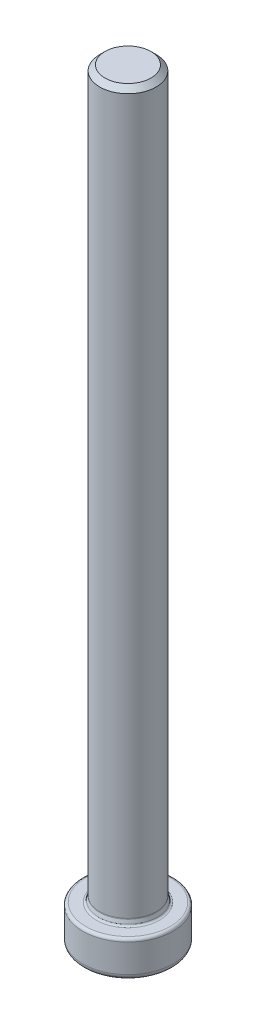
ISO-10303-21;
HEADER;
FILE_DESCRIPTION(('STEP AP214'),'2;1');
FILE_NAME('part.step','',(''),(''),'','','');
FILE_SCHEMA(('AUTOMOTIVE_DESIGN { 1 0 10303 214 1 1 1 1 }'));
ENDSEC;
DATA;
#1=APPLICATION_CONTEXT('core data for automotive mechanical design processes');
#2=APPLICATION_PROTOCOL_DEFINITION('international standard','automotive_design',2000,#1);
#3=PRODUCT_CONTEXT('',#1,'mechanical');
#4=PRODUCT('Part','Part','',(#3));
#5=PRODUCT_RELATED_PRODUCT_CATEGORY('part','',(#4));
#6=PRODUCT_DEFINITION_FORMATION('','',#4);
#7=PRODUCT_DEFINITION_CONTEXT('part definition',#1,'design');
#8=PRODUCT_DEFINITION('design','',#6,#7);
#9=PRODUCT_DEFINITION_SHAPE('','',#8);
#10=(LENGTH_UNIT() NAMED_UNIT(*) SI_UNIT(.MILLI.,.METRE.));
#11=(NAMED_UNIT(*) PLANE_ANGLE_UNIT() SI_UNIT($,.RADIAN.));
#12=(NAMED_UNIT(*) SI_UNIT($,.STERADIAN.) SOLID_ANGLE_UNIT());
#13=UNCERTAINTY_MEASURE_WITH_UNIT(LENGTH_MEASURE(1.E-05),#10,'distance_accuracy_value','');
#14=(GEOMETRIC_REPRESENTATION_CONTEXT(3) GLOBAL_UNCERTAINTY_ASSIGNED_CONTEXT((#13)) GLOBAL_UNIT_ASSIGNED_CONTEXT((#10,
#11,#12)) REPRESENTATION_CONTEXT('',''));
#15=CARTESIAN_POINT('',(0.,0.,0.));
#16=DIRECTION('',(0.,0.,1.));
#17=DIRECTION('',(1.,0.,0.));
#18=AXIS2_PLACEMENT_3D('',#15,#16,#17);
#19=CARTESIAN_POINT('',(-58.5747385824299,-70.2000070571905,13.));
#20=DIRECTION('',(0.,1.,0.));
#21=DIRECTION('',(0.,0.,-1.));
#22=AXIS2_PLACEMENT_3D('',#19,#20,#21);
#23=CYLINDRICAL_SURFACE('',#22,5.);
#24=CARTESIAN_POINT('',(-58.5747385824299,12.5,13.));
#25=DIRECTION('',(0.,1.,0.));
#26=DIRECTION('',(0.,0.,-1.));
#27=AXIS2_PLACEMENT_3D('',#24,#25,#26);
#28=CIRCLE('',#27,5.);
#29=CARTESIAN_POINT('',(-58.5747385824299,12.5,8.));
#30=VERTEX_POINT('',#29);
#31=CARTESIAN_POINT('',(-58.5747385824299,12.5,18.));
#32=VERTEX_POINT('',#31);
#33=EDGE_CURVE('E228',#30,#32,#28,.T.);
#34=ORIENTED_EDGE('',*,*,#33,.F.);
#35=CARTESIAN_POINT('',(-58.5747385824299,12.5,13.));
#36=DIRECTION('',(0.,1.,0.));
#37=DIRECTION('',(0.,0.,-1.));
#38=AXIS2_PLACEMENT_3D('',#35,#36,#37);
#39=CIRCLE('',#38,5.);
#40=EDGE_CURVE('E225',#32,#30,#39,.T.);
#41=ORIENTED_EDGE('',*,*,#40,.F.);
#42=DIRECTION('',(0.,-1.,0.));
#43=VECTOR('',#42,1.);
#44=CARTESIAN_POINT('',(-58.5747385824299,-70.2000070571905,18.));
#45=LINE('',#44,#43);
#46=CARTESIAN_POINT('',(-58.5747385824299,-114.180007057191,18.));
#47=VERTEX_POINT('',#46);
#48=EDGE_CURVE('E11',#32,#47,#45,.T.);
#49=ORIENTED_EDGE('',*,*,#48,.T.);
#50=CARTESIAN_POINT('',(-58.5747385824299,-114.180007057191,13.));
#51=DIRECTION('',(0.,-1.,0.));
#52=DIRECTION('',(0.,0.,-1.));
#53=AXIS2_PLACEMENT_3D('',#50,#51,#52);
#54=CIRCLE('',#53,5.);
#55=CARTESIAN_POINT('',(-53.5747385824299,-114.180007057191,13.));
#56=VERTEX_POINT('',#55);
#57=EDGE_CURVE('E253',#56,#47,#54,.T.);
#58=ORIENTED_EDGE('',*,*,#57,.F.);
#59=CARTESIAN_POINT('',(-58.5747385824299,-114.180007057191,13.));
#60=DIRECTION('',(0.,-1.,0.));
#61=DIRECTION('',(0.,0.,-1.));
#62=AXIS2_PLACEMENT_3D('',#59,#60,#61);
#63=CIRCLE('',#62,5.);
#64=EDGE_CURVE('E296',#47,#56,#63,.T.);
#65=ORIENTED_EDGE('',*,*,#64,.F.);
#66=ORIENTED_EDGE('',*,*,#48,.F.);
#67=EDGE_LOOP('',(#34,#41,#49,#58,#65,#66));
#68=FACE_BOUND('',#67,.T.);
#69=ADVANCED_FACE('F17',(#68),#23,.T.);
#70=CARTESIAN_POINT('',(-58.5747385824299,12.5,13.));
#71=DIRECTION('',(0.,-1.,0.));
#72=DIRECTION('',(0.,0.,1.));
#73=AXIS2_PLACEMENT_3D('',#70,#71,#72);
#74=CONICAL_SURFACE('',#73,5.,0.78539816339745);
#75=ORIENTED_EDGE('',*,*,#33,.T.);
#76=ORIENTED_EDGE('',*,*,#40,.T.);
#77=DIRECTION('',(0.,0.707106781186546,0.707106781186549));
#78=VECTOR('',#77,1.);
#79=CARTESIAN_POINT('',(-58.5747385824299,12.5,8.));
#80=LINE('',#79,#78);
#81=CARTESIAN_POINT('',(-58.5747385824299,13.42,8.92));
#82=VERTEX_POINT('',#81);
#83=EDGE_CURVE('E25',#30,#82,#80,.T.);
#84=ORIENTED_EDGE('',*,*,#83,.T.);
#85=CARTESIAN_POINT('',(-58.5747385824299,13.42,13.));
#86=DIRECTION('',(0.,1.,0.));
#87=DIRECTION('',(0.,0.,-1.));
#88=AXIS2_PLACEMENT_3D('',#85,#86,#87);
#89=CIRCLE('',#88,4.08);
#90=EDGE_CURVE('E312',#82,#82,#89,.T.);
#91=ORIENTED_EDGE('',*,*,#90,.F.);
#92=ORIENTED_EDGE('',*,*,#83,.F.);
#93=EDGE_LOOP('',(#75,#76,#84,#91,#92));
#94=FACE_BOUND('',#93,.T.);
#95=ADVANCED_FACE('F495',(#94),#74,.T.);
#96=CARTESIAN_POINT('',(-58.5747385824299,13.42,8.92));
#97=DIRECTION('',(0.,-1.,0.));
#98=DIRECTION('',(0.,0.,-1.));
#99=AXIS2_PLACEMENT_3D('',#96,#97,#98);
#100=PLANE('',#99);
#101=ORIENTED_EDGE('',*,*,#90,.T.);
#102=EDGE_LOOP('',(#101));
#103=FACE_BOUND('',#102,.T.);
#104=ADVANCED_FACE('F499',(#103),#100,.F.);
#105=CARTESIAN_POINT('',(-58.5747385824299,-114.800007057191,13.));
#106=DIRECTION('',(0.,1.,0.));
#107=DIRECTION('',(-1.,0.,0.));
#108=AXIS2_PLACEMENT_3D('',#105,#106,#107);
#109=TOROIDAL_SURFACE('',#108,5.6,0.4);
#110=CARTESIAN_POINT('',(-58.5747385824299,-114.92280816916,13.));
#111=DIRECTION('',(0.,1.,0.));
#112=DIRECTION('',(-1.,0.,0.));
#113=AXIS2_PLACEMENT_3D('',#110,#111,#112);
#114=CIRCLE('',#113,5.21931655289578);
#115=CARTESIAN_POINT('',(-63.7940551353257,-114.92280816916,13.));
#116=VERTEX_POINT('',#115);
#117=CARTESIAN_POINT('',(-53.3554220295341,-114.92280816916,13.));
#118=VERTEX_POINT('',#117);
#119=EDGE_CURVE('E248',#116,#118,#114,.T.);
#120=ORIENTED_EDGE('',*,*,#119,.F.);
#121=CARTESIAN_POINT('',(-58.5747385824299,-114.92280816916,13.));
#122=DIRECTION('',(0.,1.,0.));
#123=DIRECTION('',(-1.,0.,0.));
#124=AXIS2_PLACEMENT_3D('',#121,#122,#123);
#125=CIRCLE('',#124,5.21931655289578);
#126=EDGE_CURVE('E252',#118,#116,#125,.T.);
#127=ORIENTED_EDGE('',*,*,#126,.F.);
#128=CARTESIAN_POINT('',(-52.9747385824299,-114.800007057191,13.));
#129=DIRECTION('',(0.,0.,1.));
#130=DIRECTION('',(1.,0.,0.));
#131=AXIS2_PLACEMENT_3D('',#128,#129,#130);
#132=CIRCLE('',#131,0.4);
#133=CARTESIAN_POINT('',(-52.9747385824299,-115.200007057191,13.));
#134=VERTEX_POINT('',#133);
#135=EDGE_CURVE('E310',#118,#134,#132,.T.);
#136=ORIENTED_EDGE('',*,*,#135,.T.);
#137=CARTESIAN_POINT('',(-58.5747385824299,-115.200007057191,13.));
#138=DIRECTION('',(0.,-1.,0.));
#139=DIRECTION('',(0.,0.,1.));
#140=AXIS2_PLACEMENT_3D('',#137,#138,#139);
#141=CIRCLE('',#140,5.6);
#142=EDGE_CURVE('E420',#134,#134,#141,.T.);
#143=ORIENTED_EDGE('',*,*,#142,.F.);
#144=ORIENTED_EDGE('',*,*,#135,.F.);
#145=EDGE_LOOP('',(#120,#127,#136,#143,#144));
#146=FACE_BOUND('',#145,.T.);
#147=ADVANCED_FACE('F513',(#146),#109,.F.);
#148=CARTESIAN_POINT('',(-58.5747385824299,-114.30280816916,13.));
#149=DIRECTION('',(0.,-1.,0.));
#150=DIRECTION('',(1.,0.,0.));
#151=AXIS2_PLACEMENT_3D('',#148,#149,#150);
#152=CONICAL_SURFACE('',#151,5.01931655289578,0.312042121562536);
#153=ORIENTED_EDGE('',*,*,#119,.T.);
#154=ORIENTED_EDGE('',*,*,#126,.T.);
#155=DIRECTION('',(0.307002779922761,0.95170861776055,0.));
#156=VECTOR('',#155,1.);
#157=CARTESIAN_POINT('',(-63.5940551353257,-114.30280816916,13.));
#158=LINE('',#157,#156);
#159=CARTESIAN_POINT('',(-63.5940551353257,-114.30280816916,13.));
#160=VERTEX_POINT('',#159);
#161=EDGE_CURVE('E307',#116,#160,#158,.T.);
#162=ORIENTED_EDGE('',*,*,#161,.T.);
#163=CARTESIAN_POINT('',(-58.5747385824299,-114.30280816916,13.));
#164=DIRECTION('',(0.,1.,0.));
#165=DIRECTION('',(-1.,0.,0.));
#166=AXIS2_PLACEMENT_3D('',#163,#164,#165);
#167=CIRCLE('',#166,5.01931655289578);
#168=CARTESIAN_POINT('',(-53.5554220295341,-114.30280816916,13.));
#169=VERTEX_POINT('',#168);
#170=EDGE_CURVE('E295',#169,#160,#167,.T.);
#171=ORIENTED_EDGE('',*,*,#170,.F.);
#172=CARTESIAN_POINT('',(-58.5747385824299,-114.30280816916,13.));
#173=DIRECTION('',(0.,1.,0.));
#174=DIRECTION('',(-1.,0.,0.));
#175=AXIS2_PLACEMENT_3D('',#172,#173,#174);
#176=CIRCLE('',#175,5.01931655289578);
#177=EDGE_CURVE('E300',#160,#169,#176,.T.);
#178=ORIENTED_EDGE('',*,*,#177,.F.);
#179=ORIENTED_EDGE('',*,*,#161,.F.);
#180=EDGE_LOOP('',(#153,#154,#162,#171,#178,#179));
#181=FACE_BOUND('',#180,.T.);
#182=ADVANCED_FACE('F509',(#181),#152,.T.);
#183=CARTESIAN_POINT('',(-58.5747385824299,-114.180007057191,13.));
#184=DIRECTION('',(0.,1.,0.));
#185=DIRECTION('',(-1.,0.,0.));
#186=AXIS2_PLACEMENT_3D('',#183,#184,#185);
#187=TOROIDAL_SURFACE('',#186,5.4,0.4);
#188=ORIENTED_EDGE('',*,*,#64,.T.);
#189=CARTESIAN_POINT('',(-53.1747385824299,-114.180007057191,13.));
#190=DIRECTION('',(0.,0.,1.));
#191=DIRECTION('',(1.,0.,0.));
#192=AXIS2_PLACEMENT_3D('',#189,#190,#191);
#193=CIRCLE('',#192,0.4);
#194=EDGE_CURVE('E291',#56,#169,#193,.T.);
#195=ORIENTED_EDGE('',*,*,#194,.T.);
#196=ORIENTED_EDGE('',*,*,#170,.T.);
#197=ORIENTED_EDGE('',*,*,#177,.T.);
#198=ORIENTED_EDGE('',*,*,#194,.F.);
#199=ORIENTED_EDGE('',*,*,#57,.T.);
#200=EDGE_LOOP('',(#188,#195,#196,#197,#198,#199));
#201=FACE_BOUND('',#200,.T.);
#202=ADVANCED_FACE('F505',(#201),#187,.F.);
#203=CARTESIAN_POINT('',(-58.5747385824299,-118.200007057191,13.));
#204=DIRECTION('',(0.,-1.,0.));
#205=DIRECTION('',(0.,0.,1.));
#206=AXIS2_PLACEMENT_3D('',#203,#204,#205);
#207=CONICAL_SURFACE('',#206,4.,1.0471975511966);
#208=CARTESIAN_POINT('',(-58.5747385824299,-117.333981653406,13.));
#209=DIRECTION('',(0.,1.,0.));
#210=DIRECTION('',(0.,0.,-1.));
#211=AXIS2_PLACEMENT_3D('',#208,#209,#210);
#212=CIRCLE('',#211,2.5);
#213=CARTESIAN_POINT('',(-58.5747385824299,-117.333981653406,10.5));
#214=VERTEX_POINT('',#213);
#215=CARTESIAN_POINT('',(-58.5747385824299,-117.333981653406,15.5));
#216=VERTEX_POINT('',#215);
#217=EDGE_CURVE('E280',#214,#216,#212,.T.);
#218=ORIENTED_EDGE('',*,*,#217,.T.);
#219=CARTESIAN_POINT('',(-58.5747385824299,-117.333981653406,13.));
#220=DIRECTION('',(0.,1.,0.));
#221=DIRECTION('',(0.,0.,-1.));
#222=AXIS2_PLACEMENT_3D('',#219,#220,#221);
#223=CIRCLE('',#222,2.5);
#224=EDGE_CURVE('E283',#216,#214,#223,.T.);
#225=ORIENTED_EDGE('',*,*,#224,.T.);
#226=DIRECTION('',(0.,-0.5,-0.86602540378444));
#227=VECTOR('',#226,1.);
#228=CARTESIAN_POINT('',(-58.5747385824299,-118.200007057191,9.));
#229=LINE('',#228,#227);
#230=CARTESIAN_POINT('',(-58.5747385824299,-118.200007057191,9.));
#231=VERTEX_POINT('',#230);
#232=EDGE_CURVE('E290',#214,#231,#229,.T.);
#233=ORIENTED_EDGE('',*,*,#232,.T.);
#234=CARTESIAN_POINT('',(-58.5747385824299,-118.200007057191,13.));
#235=DIRECTION('',(0.,1.,0.));
#236=DIRECTION('',(-1.,0.,0.));
#237=AXIS2_PLACEMENT_3D('',#234,#235,#236);
#238=CIRCLE('',#237,4.);
#239=CARTESIAN_POINT('',(-55.1106369672922,-118.200007057191,11.));
#240=VERTEX_POINT('',#239);
#241=EDGE_CURVE('E185',#240,#231,#238,.T.);
#242=ORIENTED_EDGE('',*,*,#241,.F.);
#243=CARTESIAN_POINT('',(-58.5747385824299,-118.200007057191,13.));
#244=DIRECTION('',(0.,1.,0.));
#245=DIRECTION('',(-1.,0.,0.));
#246=AXIS2_PLACEMENT_3D('',#243,#244,#245);
#247=CIRCLE('',#246,4.);
#248=CARTESIAN_POINT('',(-55.1106369672922,-118.200007057191,15.));
#249=VERTEX_POINT('',#248);
#250=EDGE_CURVE('E178',#249,#240,#247,.T.);
#251=ORIENTED_EDGE('',*,*,#250,.F.);
#252=CARTESIAN_POINT('',(-58.5747385824299,-118.200007057191,13.));
#253=DIRECTION('',(0.,1.,0.));
#254=DIRECTION('',(-1.,0.,0.));
#255=AXIS2_PLACEMENT_3D('',#252,#253,#254);
#256=CIRCLE('',#255,4.);
#257=CARTESIAN_POINT('',(-58.5747385824299,-118.200007057191,17.));
#258=VERTEX_POINT('',#257);
#259=EDGE_CURVE('E182',#258,#249,#256,.T.);
#260=ORIENTED_EDGE('',*,*,#259,.F.);
#261=CARTESIAN_POINT('',(-58.5747385824299,-118.200007057191,13.));
#262=DIRECTION('',(0.,1.,0.));
#263=DIRECTION('',(-1.,0.,0.));
#264=AXIS2_PLACEMENT_3D('',#261,#262,#263);
#265=CIRCLE('',#264,4.);
#266=CARTESIAN_POINT('',(-62.0388401975677,-118.200007057191,15.));
#267=VERTEX_POINT('',#266);
#268=EDGE_CURVE('E201',#267,#258,#265,.T.);
#269=ORIENTED_EDGE('',*,*,#268,.F.);
#270=CARTESIAN_POINT('',(-58.5747385824299,-118.200007057191,13.));
#271=DIRECTION('',(0.,1.,0.));
#272=DIRECTION('',(-1.,0.,0.));
#273=AXIS2_PLACEMENT_3D('',#270,#271,#272);
#274=CIRCLE('',#273,4.);
#275=CARTESIAN_POINT('',(-62.0388401975677,-118.200007057191,11.));
#276=VERTEX_POINT('',#275);
#277=EDGE_CURVE('E271',#276,#267,#274,.T.);
#278=ORIENTED_EDGE('',*,*,#277,.F.);
#279=CARTESIAN_POINT('',(-58.5747385824299,-118.200007057191,13.));
#280=DIRECTION('',(0.,1.,0.));
#281=DIRECTION('',(-1.,0.,0.));
#282=AXIS2_PLACEMENT_3D('',#279,#280,#281);
#283=CIRCLE('',#282,4.);
#284=EDGE_CURVE('E266',#231,#276,#283,.T.);
#285=ORIENTED_EDGE('',*,*,#284,.F.);
#286=ORIENTED_EDGE('',*,*,#232,.F.);
#287=EDGE_LOOP('',(#218,#225,#233,#242,#251,#260,#269,#278,#285,#286));
#288=FACE_BOUND('',#287,.T.);
#289=ADVANCED_FACE('F181',(#288),#207,.F.);
#290=CARTESIAN_POINT('',(-58.5747385824299,-114.200007057191,13.));
#291=DIRECTION('',(0.,1.,0.));
#292=DIRECTION('',(0.,0.,-1.));
#293=AXIS2_PLACEMENT_3D('',#290,#291,#292);
#294=CYLINDRICAL_SURFACE('',#293,2.5);
#295=ORIENTED_EDGE('',*,*,#217,.F.);
#296=ORIENTED_EDGE('',*,*,#224,.F.);
#297=DIRECTION('',(0.,1.,0.));
#298=VECTOR('',#297,1.);
#299=CARTESIAN_POINT('',(-58.5747385824299,-114.200007057191,15.5));
#300=LINE('',#299,#298);
#301=CARTESIAN_POINT('',(-58.5747385824299,-114.200007057191,15.5));
#302=VERTEX_POINT('',#301);
#303=EDGE_CURVE('E287',#216,#302,#300,.T.);
#304=ORIENTED_EDGE('',*,*,#303,.T.);
#305=CARTESIAN_POINT('',(-58.5747385824299,-114.200007057191,13.));
#306=DIRECTION('',(0.,1.,0.));
#307=DIRECTION('',(0.,0.,-1.));
#308=AXIS2_PLACEMENT_3D('',#305,#306,#307);
#309=CIRCLE('',#308,2.5);
#310=EDGE_CURVE('E279',#302,#302,#309,.T.);
#311=ORIENTED_EDGE('',*,*,#310,.T.);
#312=ORIENTED_EDGE('',*,*,#303,.F.);
#313=EDGE_LOOP('',(#295,#296,#304,#311,#312));
#314=FACE_BOUND('',#313,.T.);
#315=ADVANCED_FACE('F478',(#314),#294,.F.);
#316=CARTESIAN_POINT('',(-61.0747385824299,-114.200007057191,13.));
#317=DIRECTION('',(0.,-1.,0.));
#318=DIRECTION('',(0.,0.,-1.));
#319=AXIS2_PLACEMENT_3D('',#316,#317,#318);
#320=PLANE('',#319);
#321=ORIENTED_EDGE('',*,*,#310,.F.);
#322=EDGE_LOOP('',(#321));
#323=FACE_BOUND('',#322,.T.);
#324=ADVANCED_FACE('F481',(#323),#320,.T.);
#325=CARTESIAN_POINT('',(-58.5747385824299,-118.200007057191,13.));
#326=DIRECTION('',(0.,1.,0.));
#327=DIRECTION('',(1.,0.,0.));
#328=AXIS2_PLACEMENT_3D('',#325,#326,#327);
#329=PLANE('',#328);
#330=ORIENTED_EDGE('',*,*,#241,.T.);
#331=DIRECTION('',(-1.,0.,0.));
#332=VECTOR('',#331,1.);
#333=CARTESIAN_POINT('',(-56.2653375056714,-118.200007057191,9.));
#334=LINE('',#333,#332);
#335=CARTESIAN_POINT('',(-56.2653375056714,-118.200007057191,9.));
#336=VERTEX_POINT('',#335);
#337=EDGE_CURVE('E243',#336,#231,#334,.T.);
#338=ORIENTED_EDGE('',*,*,#337,.F.);
#339=DIRECTION('',(-0.5,0.,-0.866025403784439));
#340=VECTOR('',#339,1.);
#341=CARTESIAN_POINT('',(-53.9559364289129,-118.200007057191,13.));
#342=LINE('',#341,#340);
#343=EDGE_CURVE('E239',#240,#336,#342,.T.);
#344=ORIENTED_EDGE('',*,*,#343,.F.);
#345=EDGE_LOOP('',(#330,#338,#344));
#346=FACE_BOUND('',#345,.T.);
#347=ADVANCED_FACE('F483',(#346),#329,.F.);
#348=CARTESIAN_POINT('',(-58.5747385824299,-118.200007057191,13.));
#349=DIRECTION('',(0.,1.,0.));
#350=DIRECTION('',(1.,0.,0.));
#351=AXIS2_PLACEMENT_3D('',#348,#349,#350);
#352=PLANE('',#351);
#353=ORIENTED_EDGE('',*,*,#250,.T.);
#354=DIRECTION('',(-0.5,0.,-0.866025403784439));
#355=VECTOR('',#354,1.);
#356=CARTESIAN_POINT('',(-53.9559364289129,-118.200007057191,13.));
#357=LINE('',#356,#355);
#358=CARTESIAN_POINT('',(-53.9559364289129,-118.200007057191,13.));
#359=VERTEX_POINT('',#358);
#360=EDGE_CURVE('E207',#359,#240,#357,.T.);
#361=ORIENTED_EDGE('',*,*,#360,.F.);
#362=DIRECTION('',(0.5,0.,-0.866025403784439));
#363=VECTOR('',#362,1.);
#364=CARTESIAN_POINT('',(-56.2653375056714,-118.200007057191,17.));
#365=LINE('',#364,#363);
#366=EDGE_CURVE('E204',#249,#359,#365,.T.);
#367=ORIENTED_EDGE('',*,*,#366,.F.);
#368=EDGE_LOOP('',(#353,#361,#367));
#369=FACE_BOUND('',#368,.T.);
#370=ADVANCED_FACE('F205',(#369),#352,.F.);
#371=CARTESIAN_POINT('',(-58.5747385824299,-118.200007057191,13.));
#372=DIRECTION('',(0.,1.,0.));
#373=DIRECTION('',(1.,0.,0.));
#374=AXIS2_PLACEMENT_3D('',#371,#372,#373);
#375=PLANE('',#374);
#376=ORIENTED_EDGE('',*,*,#259,.T.);
#377=DIRECTION('',(0.5,0.,-0.866025403784439));
#378=VECTOR('',#377,1.);
#379=CARTESIAN_POINT('',(-56.2653375056714,-118.200007057191,17.));
#380=LINE('',#379,#378);
#381=CARTESIAN_POINT('',(-56.2653375056714,-118.200007057191,17.));
#382=VERTEX_POINT('',#381);
#383=EDGE_CURVE('E195',#382,#249,#380,.T.);
#384=ORIENTED_EDGE('',*,*,#383,.F.);
#385=DIRECTION('',(1.,0.,0.));
#386=VECTOR('',#385,1.);
#387=CARTESIAN_POINT('',(-60.8841396591884,-118.200007057191,17.));
#388=LINE('',#387,#386);
#389=EDGE_CURVE('E198',#258,#382,#388,.T.);
#390=ORIENTED_EDGE('',*,*,#389,.F.);
#391=EDGE_LOOP('',(#376,#384,#390));
#392=FACE_BOUND('',#391,.T.);
#393=ADVANCED_FACE('F193',(#392),#375,.F.);
#394=CARTESIAN_POINT('',(-58.5747385824299,-118.200007057191,13.));
#395=DIRECTION('',(0.,1.,0.));
#396=DIRECTION('',(1.,0.,0.));
#397=AXIS2_PLACEMENT_3D('',#394,#395,#396);
#398=PLANE('',#397);
#399=ORIENTED_EDGE('',*,*,#268,.T.);
#400=DIRECTION('',(1.,0.,0.));
#401=VECTOR('',#400,1.);
#402=CARTESIAN_POINT('',(-60.8841396591884,-118.200007057191,17.));
#403=LINE('',#402,#401);
#404=CARTESIAN_POINT('',(-60.8841396591884,-118.200007057191,17.));
#405=VERTEX_POINT('',#404);
#406=EDGE_CURVE('E451',#405,#258,#403,.T.);
#407=ORIENTED_EDGE('',*,*,#406,.F.);
#408=DIRECTION('',(0.5,0.,0.866025403784439));
#409=VECTOR('',#408,1.);
#410=CARTESIAN_POINT('',(-63.1935407359469,-118.200007057191,13.));
#411=LINE('',#410,#409);
#412=EDGE_CURVE('E264',#267,#405,#411,.T.);
#413=ORIENTED_EDGE('',*,*,#412,.F.);
#414=EDGE_LOOP('',(#399,#407,#413));
#415=FACE_BOUND('',#414,.T.);
#416=ADVANCED_FACE('F462',(#415),#398,.F.);
#417=CARTESIAN_POINT('',(-58.5747385824299,-118.200007057191,13.));
#418=DIRECTION('',(0.,1.,0.));
#419=DIRECTION('',(1.,0.,0.));
#420=AXIS2_PLACEMENT_3D('',#417,#418,#419);
#421=PLANE('',#420);
#422=DIRECTION('',(-0.5,0.,0.866025403784439));
#423=VECTOR('',#422,1.);
#424=CARTESIAN_POINT('',(-60.8841396591884,-118.200007057191,9.));
#425=LINE('',#424,#423);
#426=CARTESIAN_POINT('',(-63.1935407359469,-118.200007057191,13.));
#427=VERTEX_POINT('',#426);
#428=EDGE_CURVE('E235',#276,#427,#425,.T.);
#429=ORIENTED_EDGE('',*,*,#428,.F.);
#430=ORIENTED_EDGE('',*,*,#277,.T.);
#431=DIRECTION('',(0.5,0.,0.866025403784439));
#432=VECTOR('',#431,1.);
#433=CARTESIAN_POINT('',(-63.1935407359469,-118.200007057191,13.));
#434=LINE('',#433,#432);
#435=EDGE_CURVE('E260',#427,#267,#434,.T.);
#436=ORIENTED_EDGE('',*,*,#435,.F.);
#437=EDGE_LOOP('',(#429,#430,#436));
#438=FACE_BOUND('',#437,.T.);
#439=ADVANCED_FACE('F466',(#438),#421,.F.);
#440=CARTESIAN_POINT('',(-58.5747385824299,-118.200007057191,13.));
#441=DIRECTION('',(0.,1.,0.));
#442=DIRECTION('',(1.,0.,0.));
#443=AXIS2_PLACEMENT_3D('',#440,#441,#442);
#444=PLANE('',#443);
#445=ORIENTED_EDGE('',*,*,#284,.T.);
#446=DIRECTION('',(-0.5,0.,0.866025403784439));
#447=VECTOR('',#446,1.);
#448=CARTESIAN_POINT('',(-60.8841396591884,-118.200007057191,9.));
#449=LINE('',#448,#447);
#450=CARTESIAN_POINT('',(-60.8841396591884,-118.200007057191,9.));
#451=VERTEX_POINT('',#450);
#452=EDGE_CURVE('E231',#451,#276,#449,.T.);
#453=ORIENTED_EDGE('',*,*,#452,.F.);
#454=DIRECTION('',(-1.,0.,0.));
#455=VECTOR('',#454,1.);
#456=CARTESIAN_POINT('',(-56.2653375056714,-118.200007057191,9.));
#457=LINE('',#456,#455);
#458=EDGE_CURVE('E244',#231,#451,#457,.T.);
#459=ORIENTED_EDGE('',*,*,#458,.F.);
#460=EDGE_LOOP('',(#445,#453,#459));
#461=FACE_BOUND('',#460,.T.);
#462=ADVANCED_FACE('F474',(#461),#444,.F.);
#463=CARTESIAN_POINT('',(-63.1935407359469,-118.200007057191,13.));
#464=DIRECTION('',(0.866025403784439,0.,-0.5));
#465=DIRECTION('',(0.,-1.,0.));
#466=AXIS2_PLACEMENT_3D('',#463,#464,#465);
#467=PLANE('',#466);
#468=DIRECTION('',(0.,-1.,0.));
#469=VECTOR('',#468,1.);
#470=CARTESIAN_POINT('',(-63.1935407359469,-118.200007057191,13.));
#471=LINE('',#470,#469);
#472=CARTESIAN_POINT('',(-63.1935407359469,-121.700007057191,13.));
#473=VERTEX_POINT('',#472);
#474=EDGE_CURVE('E259',#427,#473,#471,.T.);
#475=ORIENTED_EDGE('',*,*,#474,.F.);
#476=ORIENTED_EDGE('',*,*,#435,.T.);
#477=ORIENTED_EDGE('',*,*,#412,.T.);
#478=DIRECTION('',(0.,-1.,0.));
#479=VECTOR('',#478,1.);
#480=CARTESIAN_POINT('',(-60.8841396591884,-118.200007057191,17.));
#481=LINE('',#480,#479);
#482=CARTESIAN_POINT('',(-60.8841396591884,-121.700007057191,17.));
#483=VERTEX_POINT('',#482);
#484=EDGE_CURVE('E448',#405,#483,#481,.T.);
#485=ORIENTED_EDGE('',*,*,#484,.T.);
#486=CARTESIAN_POINT('',(-63.1935407359469,-121.700007057191,13.));
#487=CARTESIAN_POINT('',(-62.0388401975677,-120.545306518811,15.));
#488=CARTESIAN_POINT('',(-60.8841396591884,-121.700007057191,17.));
#489=(BOUNDED_CURVE() B_SPLINE_CURVE(2,(#486,#487,#488),.UNSPECIFIED.,.F.,
.F.) B_SPLINE_CURVE_WITH_KNOTS((3,3),(-0.705094379751374,-0.147934530722328),
.UNSPECIFIED.) CURVE() GEOMETRIC_REPRESENTATION_ITEM() RATIONAL_B_SPLINE_CURVE((1.11602540378444,
1.28867513459481,1.11602540378444)) REPRESENTATION_ITEM(''));
#490=EDGE_CURVE('E341',#473,#483,#489,.T.);
#491=ORIENTED_EDGE('',*,*,#490,.F.);
#492=EDGE_LOOP('',(#475,#476,#477,#485,#491));
#493=FACE_BOUND('',#492,.T.);
#494=ADVANCED_FACE('F551',(#493),#467,.T.);
#495=CARTESIAN_POINT('',(-60.8841396591884,-118.200007057191,9.));
#496=DIRECTION('',(0.866025403784439,0.,0.5));
#497=DIRECTION('',(0.,-1.,0.));
#498=AXIS2_PLACEMENT_3D('',#495,#496,#497);
#499=PLANE('',#498);
#500=DIRECTION('',(0.,-1.,0.));
#501=VECTOR('',#500,1.);
#502=CARTESIAN_POINT('',(-60.8841396591884,-118.200007057191,9.));
#503=LINE('',#502,#501);
#504=CARTESIAN_POINT('',(-60.8841396591884,-121.700007057191,9.));
#505=VERTEX_POINT('',#504);
#506=EDGE_CURVE('E236',#451,#505,#503,.T.);
#507=ORIENTED_EDGE('',*,*,#506,.F.);
#508=ORIENTED_EDGE('',*,*,#452,.T.);
#509=ORIENTED_EDGE('',*,*,#428,.T.);
#510=ORIENTED_EDGE('',*,*,#474,.T.);
#511=CARTESIAN_POINT('',(-60.8841396591884,-121.70000705719,9.));
#512=CARTESIAN_POINT('',(-62.0388401975677,-120.545306518811,11.));
#513=CARTESIAN_POINT('',(-63.1935407359469,-121.700007057191,13.));
#514=(BOUNDED_CURVE() B_SPLINE_CURVE(2,(#511,#512,#513),.UNSPECIFIED.,.F.,
.F.) B_SPLINE_CURVE_WITH_KNOTS((3,3),(-0.705094379751375,-0.147934530722328),
.UNSPECIFIED.) CURVE() GEOMETRIC_REPRESENTATION_ITEM() RATIONAL_B_SPLINE_CURVE((1.11602540378444,
1.28867513459482,1.11602540378444)) REPRESENTATION_ITEM(''));
#515=EDGE_CURVE('E349',#505,#473,#514,.T.);
#516=ORIENTED_EDGE('',*,*,#515,.F.);
#517=EDGE_LOOP('',(#507,#508,#509,#510,#516));
#518=FACE_BOUND('',#517,.T.);
#519=ADVANCED_FACE('F470',(#518),#499,.T.);
#520=CARTESIAN_POINT('',(-56.2653375056714,-118.200007057191,9.));
#521=DIRECTION('',(0.,0.,1.));
#522=DIRECTION('',(1.,0.,0.));
#523=AXIS2_PLACEMENT_3D('',#520,#521,#522);
#524=PLANE('',#523);
#525=DIRECTION('',(0.,-1.,0.));
#526=VECTOR('',#525,1.);
#527=CARTESIAN_POINT('',(-56.2653375056714,-118.200007057191,9.));
#528=LINE('',#527,#526);
#529=CARTESIAN_POINT('',(-56.2653375056714,-121.700007057191,9.));
#530=VERTEX_POINT('',#529);
#531=EDGE_CURVE('E240',#336,#530,#528,.T.);
#532=ORIENTED_EDGE('',*,*,#531,.F.);
#533=ORIENTED_EDGE('',*,*,#337,.T.);
#534=ORIENTED_EDGE('',*,*,#458,.T.);
#535=ORIENTED_EDGE('',*,*,#506,.T.);
#536=CARTESIAN_POINT('',(-56.2653375056714,-121.700007057191,9.));
#537=CARTESIAN_POINT('',(-58.5747385824299,-120.545306518811,9.00000000000002));
#538=CARTESIAN_POINT('',(-60.8841396591884,-121.700007057191,9.));
#539=(BOUNDED_CURVE() B_SPLINE_CURVE(2,(#536,#537,#538),.UNSPECIFIED.,.F.,
.F.) B_SPLINE_CURVE_WITH_KNOTS((3,3),(-0.705094379751374,-0.147934530722328),
.UNSPECIFIED.) CURVE() GEOMETRIC_REPRESENTATION_ITEM() RATIONAL_B_SPLINE_CURVE((1.11602540378444,
1.28867513459482,1.11602540378444)) REPRESENTATION_ITEM(''));
#540=EDGE_CURVE('E365',#530,#505,#539,.T.);
#541=ORIENTED_EDGE('',*,*,#540,.F.);
#542=EDGE_LOOP('',(#532,#533,#534,#535,#541));
#543=FACE_BOUND('',#542,.T.);
#544=ADVANCED_FACE('F550',(#543),#524,.T.);
#545=CARTESIAN_POINT('',(-53.9559364289129,-118.200007057191,13.));
#546=DIRECTION('',(-0.866025403784439,0.,0.5));
#547=DIRECTION('',(0.,1.,0.));
#548=AXIS2_PLACEMENT_3D('',#545,#546,#547);
#549=PLANE('',#548);
#550=DIRECTION('',(0.,-1.,0.));
#551=VECTOR('',#550,1.);
#552=CARTESIAN_POINT('',(-53.9559364289129,-118.200007057191,13.));
#553=LINE('',#552,#551);
#554=CARTESIAN_POINT('',(-53.9559364289129,-121.700007057191,13.));
#555=VERTEX_POINT('',#554);
#556=EDGE_CURVE('E211',#359,#555,#553,.T.);
#557=ORIENTED_EDGE('',*,*,#556,.F.);
#558=ORIENTED_EDGE('',*,*,#360,.T.);
#559=ORIENTED_EDGE('',*,*,#343,.T.);
#560=ORIENTED_EDGE('',*,*,#531,.T.);
#561=CARTESIAN_POINT('',(-53.9559364289129,-121.700007057191,13.));
#562=CARTESIAN_POINT('',(-55.1106369672922,-120.545306518811,11.));
#563=CARTESIAN_POINT('',(-56.2653375056714,-121.700007057191,9.));
#564=(BOUNDED_CURVE() B_SPLINE_CURVE(2,(#561,#562,#563),.UNSPECIFIED.,.F.,
.F.) B_SPLINE_CURVE_WITH_KNOTS((3,3),(-0.705094379751373,-0.147934530722327),
.UNSPECIFIED.) CURVE() GEOMETRIC_REPRESENTATION_ITEM() RATIONAL_B_SPLINE_CURVE((1.11602540378444,
1.28867513459481,1.11602540378444)) REPRESENTATION_ITEM(''));
#565=EDGE_CURVE('E388',#555,#530,#564,.T.);
#566=ORIENTED_EDGE('',*,*,#565,.F.);
#567=EDGE_LOOP('',(#557,#558,#559,#560,#566));
#568=FACE_BOUND('',#567,.T.);
#569=ADVANCED_FACE('F547',(#568),#549,.T.);
#570=CARTESIAN_POINT('',(-56.2653375056714,-118.200007057191,17.));
#571=DIRECTION('',(-0.866025403784439,0.,-0.5));
#572=DIRECTION('',(-0.5,0.,0.866025403784439));
#573=AXIS2_PLACEMENT_3D('',#570,#571,#572);
#574=PLANE('',#573);
#575=DIRECTION('',(0.,-1.,0.));
#576=VECTOR('',#575,1.);
#577=CARTESIAN_POINT('',(-56.2653375056714,-118.200007057191,17.));
#578=LINE('',#577,#576);
#579=CARTESIAN_POINT('',(-56.2653375056714,-121.700007057191,17.));
#580=VERTEX_POINT('',#579);
#581=EDGE_CURVE('E215',#382,#580,#578,.T.);
#582=ORIENTED_EDGE('',*,*,#581,.F.);
#583=ORIENTED_EDGE('',*,*,#383,.T.);
#584=ORIENTED_EDGE('',*,*,#366,.T.);
#585=ORIENTED_EDGE('',*,*,#556,.T.);
#586=CARTESIAN_POINT('',(-56.2653375056714,-121.700007057191,17.));
#587=CARTESIAN_POINT('',(-55.1106369672922,-120.545306518811,15.));
#588=CARTESIAN_POINT('',(-53.9559364289129,-121.700007057191,13.));
#589=(BOUNDED_CURVE() B_SPLINE_CURVE(2,(#586,#587,#588),.UNSPECIFIED.,.F.,
.F.) B_SPLINE_CURVE_WITH_KNOTS((3,3),(-0.705094379751374,-0.147934530722328),
.UNSPECIFIED.) CURVE() GEOMETRIC_REPRESENTATION_ITEM() RATIONAL_B_SPLINE_CURVE((1.11602540378444,
1.28867513459482,1.11602540378444)) REPRESENTATION_ITEM(''));
#590=EDGE_CURVE('E369',#580,#555,#589,.T.);
#591=ORIENTED_EDGE('',*,*,#590,.F.);
#592=EDGE_LOOP('',(#582,#583,#584,#585,#591));
#593=FACE_BOUND('',#592,.T.);
#594=ADVANCED_FACE('F213',(#593),#574,.T.);
#595=CARTESIAN_POINT('',(-60.8841396591884,-118.200007057191,17.));
#596=DIRECTION('',(0.,0.,-1.));
#597=DIRECTION('',(-1.,0.,0.));
#598=AXIS2_PLACEMENT_3D('',#595,#596,#597);
#599=PLANE('',#598);
#600=ORIENTED_EDGE('',*,*,#484,.F.);
#601=ORIENTED_EDGE('',*,*,#406,.T.);
#602=ORIENTED_EDGE('',*,*,#389,.T.);
#603=ORIENTED_EDGE('',*,*,#581,.T.);
#604=CARTESIAN_POINT('',(-60.8841396591884,-121.700007057191,17.));
#605=CARTESIAN_POINT('',(-58.5747385824299,-120.545306518811,17.));
#606=CARTESIAN_POINT('',(-56.2653375056714,-121.700007057191,17.));
#607=(BOUNDED_CURVE() B_SPLINE_CURVE(2,(#604,#605,#606),.UNSPECIFIED.,.F.,
.F.) B_SPLINE_CURVE_WITH_KNOTS((3,3),(-0.705094379751374,-0.147934530722328),
.UNSPECIFIED.) CURVE() GEOMETRIC_REPRESENTATION_ITEM() RATIONAL_B_SPLINE_CURVE((1.11602540378444,
1.28867513459481,1.11602540378444)) REPRESENTATION_ITEM(''));
#608=EDGE_CURVE('E325',#483,#580,#607,.T.);
#609=ORIENTED_EDGE('',*,*,#608,.F.);
#610=EDGE_LOOP('',(#600,#601,#602,#603,#609));
#611=FACE_BOUND('',#610,.T.);
#612=ADVANCED_FACE('F457',(#611),#599,.T.);
#613=CARTESIAN_POINT('',(-58.5747385824299,-121.700007057191,13.));
#614=DIRECTION('',(0.,1.,0.));
#615=DIRECTION('',(1.,0.,0.));
#616=AXIS2_PLACEMENT_3D('',#613,#614,#615);
#617=PLANE('',#616);
#618=CARTESIAN_POINT('',(-58.5747385824299,-121.700007057191,13.));
#619=DIRECTION('',(0.,-1.,0.));
#620=DIRECTION('',(0.,0.,-1.));
#621=AXIS2_PLACEMENT_3D('',#618,#619,#620);
#622=CIRCLE('',#621,4.61880215351701);
#623=EDGE_CURVE('E358',#473,#505,#622,.T.);
#624=ORIENTED_EDGE('',*,*,#623,.F.);
#625=CARTESIAN_POINT('',(-58.5747385824299,-121.700007057191,13.));
#626=DIRECTION('',(0.,1.,0.));
#627=DIRECTION('',(-1.,0.,0.));
#628=AXIS2_PLACEMENT_3D('',#625,#626,#627);
#629=CIRCLE('',#628,4.61880215351701);
#630=EDGE_CURVE('E348',#473,#483,#629,.T.);
#631=ORIENTED_EDGE('',*,*,#630,.T.);
#632=CARTESIAN_POINT('',(-58.5747385824299,-121.700007057191,13.));
#633=DIRECTION('',(0.,1.,0.));
#634=DIRECTION('',(-1.,0.,0.));
#635=AXIS2_PLACEMENT_3D('',#632,#633,#634);
#636=CIRCLE('',#635,4.61880215351701);
#637=EDGE_CURVE('E322',#483,#580,#636,.T.);
#638=ORIENTED_EDGE('',*,*,#637,.T.);
#639=CARTESIAN_POINT('',(-58.5747385824299,-121.700007057191,13.));
#640=DIRECTION('',(0.,1.,0.));
#641=DIRECTION('',(-1.,0.,0.));
#642=AXIS2_PLACEMENT_3D('',#639,#640,#641);
#643=CIRCLE('',#642,4.61880215351701);
#644=EDGE_CURVE('E331',#580,#555,#643,.T.);
#645=ORIENTED_EDGE('',*,*,#644,.T.);
#646=CARTESIAN_POINT('',(-58.5747385824299,-121.700007057191,13.));
#647=DIRECTION('',(0.,1.,0.));
#648=DIRECTION('',(-1.,0.,0.));
#649=AXIS2_PLACEMENT_3D('',#646,#647,#648);
#650=CIRCLE('',#649,4.61880215351701);
#651=EDGE_CURVE('E378',#555,#530,#650,.T.);
#652=ORIENTED_EDGE('',*,*,#651,.T.);
#653=CARTESIAN_POINT('',(-58.5747385824299,-121.700007057191,13.));
#654=DIRECTION('',(0.,-1.,0.));
#655=DIRECTION('',(0.,0.,-1.));
#656=AXIS2_PLACEMENT_3D('',#653,#654,#655);
#657=CIRCLE('',#656,4.61880215351701);
#658=EDGE_CURVE('E396',#505,#530,#657,.T.);
#659=ORIENTED_EDGE('',*,*,#658,.F.);
#660=EDGE_LOOP('',(#624,#631,#638,#645,#652,#659));
#661=FACE_BOUND('',#660,.T.);
#662=CARTESIAN_POINT('',(-58.5747385824299,-121.700007057191,13.));
#663=DIRECTION('',(0.,1.,0.));
#664=DIRECTION('',(0.,0.,-1.));
#665=AXIS2_PLACEMENT_3D('',#662,#663,#664);
#666=CIRCLE('',#665,7.);
#667=CARTESIAN_POINT('',(-58.5747385824299,-121.700007057191,20.));
#668=VERTEX_POINT('',#667);
#669=EDGE_CURVE('E445',#668,#668,#666,.T.);
#670=ORIENTED_EDGE('',*,*,#669,.F.);
#671=EDGE_LOOP('',(#670));
#672=FACE_BOUND('',#671,.T.);
#673=ADVANCED_FACE('F532',(#661,#672),#617,.F.);
#674=CARTESIAN_POINT('',(-58.5747385824299,-120.700007057191,13.));
#675=DIRECTION('',(0.,1.,0.));
#676=DIRECTION('',(0.,0.,-1.));
#677=AXIS2_PLACEMENT_3D('',#674,#675,#676);
#678=TOROIDAL_SURFACE('',#677,7.,1.);
#679=CARTESIAN_POINT('',(-58.5747385824299,-120.700007057191,13.));
#680=DIRECTION('',(0.,-1.,0.));
#681=DIRECTION('',(0.,0.,-1.));
#682=AXIS2_PLACEMENT_3D('',#679,#680,#681);
#683=CIRCLE('',#682,8.);
#684=CARTESIAN_POINT('',(-58.5747385824299,-120.700007057191,21.));
#685=VERTEX_POINT('',#684);
#686=EDGE_CURVE('E434',#685,#685,#683,.T.);
#687=ORIENTED_EDGE('',*,*,#686,.T.);
#688=CARTESIAN_POINT('',(-58.5747385824299,-120.700007057191,20.));
#689=DIRECTION('',(1.,0.,0.));
#690=DIRECTION('',(0.,0.,1.));
#691=AXIS2_PLACEMENT_3D('',#688,#689,#690);
#692=CIRCLE('',#691,1.);
#693=EDGE_CURVE('E440',#685,#668,#692,.T.);
#694=ORIENTED_EDGE('',*,*,#693,.T.);
#695=ORIENTED_EDGE('',*,*,#669,.T.);
#696=ORIENTED_EDGE('',*,*,#693,.F.);
#697=EDGE_LOOP('',(#687,#694,#695,#696));
#698=FACE_BOUND('',#697,.T.);
#699=ADVANCED_FACE('F529',(#698),#678,.T.);
#700=CARTESIAN_POINT('',(-58.5747385824299,-70.2000070571905,13.));
#701=DIRECTION('',(0.,1.,0.));
#702=DIRECTION('',(0.,0.,-1.));
#703=AXIS2_PLACEMENT_3D('',#700,#701,#702);
#704=CYLINDRICAL_SURFACE('',#703,8.);
#705=CARTESIAN_POINT('',(-58.5747385824299,-115.700007057191,13.));
#706=DIRECTION('',(0.,1.,0.));
#707=DIRECTION('',(0.,0.,-1.));
#708=AXIS2_PLACEMENT_3D('',#705,#706,#707);
#709=CIRCLE('',#708,8.);
#710=CARTESIAN_POINT('',(-58.5747385824299,-115.700007057191,21.));
#711=VERTEX_POINT('',#710);
#712=EDGE_CURVE('E332',#711,#711,#709,.T.);
#713=ORIENTED_EDGE('',*,*,#712,.F.);
#714=DIRECTION('',(0.,-1.,0.));
#715=VECTOR('',#714,1.);
#716=CARTESIAN_POINT('',(-58.5747385824299,-70.2000070571905,21.));
#717=LINE('',#716,#715);
#718=EDGE_CURVE('E339',#711,#685,#717,.T.);
#719=ORIENTED_EDGE('',*,*,#718,.T.);
#720=ORIENTED_EDGE('',*,*,#686,.F.);
#721=ORIENTED_EDGE('',*,*,#718,.F.);
#722=EDGE_LOOP('',(#713,#719,#720,#721));
#723=FACE_BOUND('',#722,.T.);
#724=ADVANCED_FACE('F526',(#723),#704,.T.);
#725=CARTESIAN_POINT('',(-58.5747385824299,-115.700007057191,13.));
#726=DIRECTION('',(0.,1.,0.));
#727=DIRECTION('',(0.,0.,-1.));
#728=AXIS2_PLACEMENT_3D('',#725,#726,#727);
#729=TOROIDAL_SURFACE('',#728,7.5,0.5);
#730=CARTESIAN_POINT('',(-58.5747385824299,-115.200007057191,13.));
#731=DIRECTION('',(0.,1.,0.));
#732=DIRECTION('',(0.,0.,-1.));
#733=AXIS2_PLACEMENT_3D('',#730,#731,#732);
#734=CIRCLE('',#733,7.5);
#735=CARTESIAN_POINT('',(-58.5747385824299,-115.200007057191,20.5));
#736=VERTEX_POINT('',#735);
#737=EDGE_CURVE('E347',#736,#736,#734,.T.);
#738=ORIENTED_EDGE('',*,*,#737,.F.);
#739=CARTESIAN_POINT('',(-58.5747385824299,-115.700007057191,20.5));
#740=DIRECTION('',(1.,0.,0.));
#741=DIRECTION('',(0.,0.,1.));
#742=AXIS2_PLACEMENT_3D('',#739,#740,#741);
#743=CIRCLE('',#742,0.5);
#744=EDGE_CURVE('E340',#736,#711,#743,.T.);
#745=ORIENTED_EDGE('',*,*,#744,.T.);
#746=ORIENTED_EDGE('',*,*,#712,.T.);
#747=ORIENTED_EDGE('',*,*,#744,.F.);
#748=EDGE_LOOP('',(#738,#745,#746,#747));
#749=FACE_BOUND('',#748,.T.);
#750=ADVANCED_FACE('F520',(#749),#729,.T.);
#751=CARTESIAN_POINT('',(-58.5747385824299,-115.200007057191,5.));
#752=DIRECTION('',(0.,-1.,0.));
#753=DIRECTION('',(0.,0.,-1.));
#754=AXIS2_PLACEMENT_3D('',#751,#752,#753);
#755=PLANE('',#754);
#756=ORIENTED_EDGE('',*,*,#142,.T.);
#757=EDGE_LOOP('',(#756));
#758=FACE_BOUND('',#757,.T.);
#759=ORIENTED_EDGE('',*,*,#737,.T.);
#760=EDGE_LOOP('',(#759));
#761=FACE_BOUND('',#760,.T.);
#762=ADVANCED_FACE('F516',(#758,#761),#755,.F.);
#763=CARTESIAN_POINT('',(-58.5747385824299,-121.700007057191,13.));
#764=DIRECTION('',(0.,-1.,0.));
#765=DIRECTION('',(1.,0.,0.));
#766=AXIS2_PLACEMENT_3D('',#763,#764,#765);
#767=CONICAL_SURFACE('',#766,4.61880215351701,0.785398163397452);
#768=ORIENTED_EDGE('',*,*,#630,.F.);
#769=ORIENTED_EDGE('',*,*,#490,.T.);
#770=EDGE_LOOP('',(#768,#769));
#771=FACE_BOUND('',#770,.T.);
#772=ADVANCED_FACE('F519',(#771),#767,.F.);
#773=CARTESIAN_POINT('',(-58.5747385824299,-121.700007057191,13.));
#774=DIRECTION('',(0.,-1.,0.));
#775=DIRECTION('',(1.,0.,0.));
#776=AXIS2_PLACEMENT_3D('',#773,#774,#775);
#777=CONICAL_SURFACE('',#776,4.61880215351701,0.785398163397452);
#778=ORIENTED_EDGE('',*,*,#623,.T.);
#779=ORIENTED_EDGE('',*,*,#515,.T.);
#780=EDGE_LOOP('',(#778,#779));
#781=FACE_BOUND('',#780,.T.);
#782=ADVANCED_FACE('F581',(#781),#777,.F.);
#783=CARTESIAN_POINT('',(-58.5747385824299,-121.700007057191,13.));
#784=DIRECTION('',(0.,-1.,0.));
#785=DIRECTION('',(1.,0.,0.));
#786=AXIS2_PLACEMENT_3D('',#783,#784,#785);
#787=CONICAL_SURFACE('',#786,4.61880215351701,0.785398163397452);
#788=ORIENTED_EDGE('',*,*,#658,.T.);
#789=ORIENTED_EDGE('',*,*,#540,.T.);
#790=EDGE_LOOP('',(#788,#789));
#791=FACE_BOUND('',#790,.T.);
#792=ADVANCED_FACE('F618',(#791),#787,.F.);
#793=CARTESIAN_POINT('',(-58.5747385824299,-121.700007057191,13.));
#794=DIRECTION('',(0.,-1.,0.));
#795=DIRECTION('',(1.,0.,0.));
#796=AXIS2_PLACEMENT_3D('',#793,#794,#795);
#797=CONICAL_SURFACE('',#796,4.61880215351701,0.785398163397452);
#798=ORIENTED_EDGE('',*,*,#651,.F.);
#799=ORIENTED_EDGE('',*,*,#565,.T.);
#800=EDGE_LOOP('',(#798,#799));
#801=FACE_BOUND('',#800,.T.);
#802=ADVANCED_FACE('F597',(#801),#797,.F.);
#803=CARTESIAN_POINT('',(-58.5747385824299,-121.700007057191,13.));
#804=DIRECTION('',(0.,-1.,0.));
#805=DIRECTION('',(1.,0.,0.));
#806=AXIS2_PLACEMENT_3D('',#803,#804,#805);
#807=CONICAL_SURFACE('',#806,4.61880215351701,0.785398163397452);
#808=ORIENTED_EDGE('',*,*,#644,.F.);
#809=ORIENTED_EDGE('',*,*,#590,.T.);
#810=EDGE_LOOP('',(#808,#809));
#811=FACE_BOUND('',#810,.T.);
#812=ADVANCED_FACE('F609',(#811),#807,.F.);
#813=CARTESIAN_POINT('',(-58.5747385824299,-121.700007057191,13.));
#814=DIRECTION('',(0.,-1.,0.));
#815=DIRECTION('',(1.,0.,0.));
#816=AXIS2_PLACEMENT_3D('',#813,#814,#815);
#817=CONICAL_SURFACE('',#816,4.61880215351701,0.785398163397452);
#818=ORIENTED_EDGE('',*,*,#637,.F.);
#819=ORIENTED_EDGE('',*,*,#608,.T.);
#820=EDGE_LOOP('',(#818,#819));
#821=FACE_BOUND('',#820,.T.);
#822=ADVANCED_FACE('F612',(#821),#817,.F.);
#823=CLOSED_SHELL('',(#69,#95,#104,#147,#182,#202,#289,#315,#324,#347,#370,#393,#416,#439,#462,
#494,#519,#544,#569,#594,#612,#673,#699,#724,#750,#762,#772,#782,#792,#802,#812,#822));
#824=MANIFOLD_SOLID_BREP('B1',#823);
#825=ADVANCED_BREP_SHAPE_REPRESENTATION('',(#18,#824),#14);
#826=SHAPE_DEFINITION_REPRESENTATION(#9,#825);
ENDSEC;
END-ISO-10303-21;
